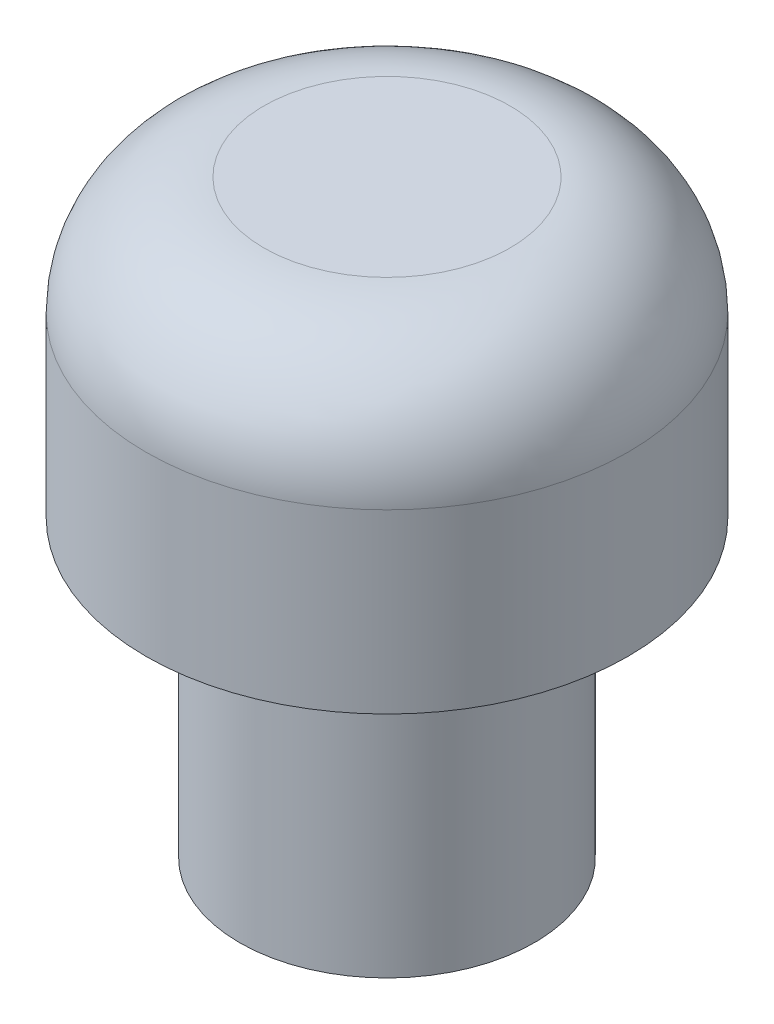
ISO-10303-21;
HEADER;
FILE_DESCRIPTION(('STEP AP214'),'2;1');
FILE_NAME('part.step','',(''),(''),'','','');
FILE_SCHEMA(('AUTOMOTIVE_DESIGN { 1 0 10303 214 1 1 1 1 }'));
ENDSEC;
DATA;
#1=APPLICATION_CONTEXT('core data for automotive mechanical design processes');
#2=APPLICATION_PROTOCOL_DEFINITION('international standard','automotive_design',2000,#1);
#3=PRODUCT_CONTEXT('',#1,'mechanical');
#4=PRODUCT('Part','Part','',(#3));
#5=PRODUCT_RELATED_PRODUCT_CATEGORY('part','',(#4));
#6=PRODUCT_DEFINITION_FORMATION('','',#4);
#7=PRODUCT_DEFINITION_CONTEXT('part definition',#1,'design');
#8=PRODUCT_DEFINITION('design','',#6,#7);
#9=PRODUCT_DEFINITION_SHAPE('','',#8);
#10=(LENGTH_UNIT() NAMED_UNIT(*) SI_UNIT(.MILLI.,.METRE.));
#11=(NAMED_UNIT(*) PLANE_ANGLE_UNIT() SI_UNIT($,.RADIAN.));
#12=(NAMED_UNIT(*) SI_UNIT($,.STERADIAN.) SOLID_ANGLE_UNIT());
#13=UNCERTAINTY_MEASURE_WITH_UNIT(LENGTH_MEASURE(1.E-05),#10,'distance_accuracy_value','');
#14=(GEOMETRIC_REPRESENTATION_CONTEXT(3) GLOBAL_UNCERTAINTY_ASSIGNED_CONTEXT((#13)) GLOBAL_UNIT_ASSIGNED_CONTEXT((#10,
#11,#12)) REPRESENTATION_CONTEXT('',''));
#15=CARTESIAN_POINT('',(0.,0.,0.));
#16=DIRECTION('',(0.,0.,1.));
#17=DIRECTION('',(1.,0.,0.));
#18=AXIS2_PLACEMENT_3D('',#15,#16,#17);
#19=CARTESIAN_POINT('',(0.,6.35,0.));
#20=DIRECTION('',(0.,-1.,0.));
#21=DIRECTION('',(0.,0.,-1.));
#22=AXIS2_PLACEMENT_3D('',#19,#20,#21);
#23=CYLINDRICAL_SURFACE('',#22,3.175);
#24=CARTESIAN_POINT('',(0.,6.35,0.));
#25=DIRECTION('',(0.,1.,0.));
#26=DIRECTION('',(0.,0.,1.));
#27=AXIS2_PLACEMENT_3D('',#24,#25,#26);
#28=CIRCLE('',#27,3.175);
#29=CARTESIAN_POINT('',(0.,6.35,3.175));
#30=VERTEX_POINT('',#29);
#31=EDGE_CURVE('E50',#30,#30,#28,.T.);
#32=ORIENTED_EDGE('',*,*,#31,.F.);
#33=EDGE_LOOP('',(#32));
#34=FACE_BOUND('',#33,.T.);
#35=CARTESIAN_POINT('',(0.,0.,0.));
#36=DIRECTION('',(0.,1.,0.));
#37=DIRECTION('',(0.,0.,1.));
#38=AXIS2_PLACEMENT_3D('',#35,#36,#37);
#39=CIRCLE('',#38,3.175);
#40=CARTESIAN_POINT('',(0.,0.,3.175));
#41=VERTEX_POINT('',#40);
#42=EDGE_CURVE('E55',#41,#41,#39,.T.);
#43=ORIENTED_EDGE('',*,*,#42,.T.);
#44=EDGE_LOOP('',(#43));
#45=FACE_BOUND('',#44,.T.);
#46=ADVANCED_FACE('F37',(#34,#45),#23,.T.);
#47=CARTESIAN_POINT('',(0.,0.,0.));
#48=DIRECTION('',(0.,1.,0.));
#49=DIRECTION('',(0.,0.,1.));
#50=AXIS2_PLACEMENT_3D('',#47,#48,#49);
#51=PLANE('',#50);
#52=ORIENTED_EDGE('',*,*,#42,.F.);
#53=EDGE_LOOP('',(#52));
#54=FACE_BOUND('',#53,.T.);
#55=ADVANCED_FACE('F81',(#54),#51,.F.);
#56=CARTESIAN_POINT('',(0.,12.7,0.));
#57=DIRECTION('',(0.,-1.,0.));
#58=DIRECTION('',(0.,0.,-1.));
#59=AXIS2_PLACEMENT_3D('',#56,#57,#58);
#60=CYLINDRICAL_SURFACE('',#59,5.1920131688595);
#61=CARTESIAN_POINT('',(0.,10.16,0.));
#62=DIRECTION('',(0.,1.,0.));
#63=DIRECTION('',(0.,0.,1.));
#64=AXIS2_PLACEMENT_3D('',#61,#62,#63);
#65=CIRCLE('',#64,5.1920131688595);
#66=CARTESIAN_POINT('',(0.,10.16,5.1920131688595));
#67=VERTEX_POINT('',#66);
#68=EDGE_CURVE('E10',#67,#67,#65,.F.);
#69=ORIENTED_EDGE('',*,*,#68,.T.);
#70=EDGE_LOOP('',(#69));
#71=FACE_BOUND('',#70,.T.);
#72=CARTESIAN_POINT('',(0.,6.35,0.));
#73=DIRECTION('',(0.,1.,0.));
#74=DIRECTION('',(0.,0.,1.));
#75=AXIS2_PLACEMENT_3D('',#72,#73,#74);
#76=CIRCLE('',#75,5.1920131688595);
#77=CARTESIAN_POINT('',(0.,6.35,5.1920131688595));
#78=VERTEX_POINT('',#77);
#79=EDGE_CURVE('E60',#78,#78,#76,.T.);
#80=ORIENTED_EDGE('',*,*,#79,.T.);
#81=EDGE_LOOP('',(#80));
#82=FACE_BOUND('',#81,.T.);
#83=ADVANCED_FACE('F66',(#71,#82),#60,.T.);
#84=CARTESIAN_POINT('',(0.,12.7,0.));
#85=DIRECTION('',(0.,1.,0.));
#86=DIRECTION('',(0.,0.,1.));
#87=AXIS2_PLACEMENT_3D('',#84,#85,#86);
#88=PLANE('',#87);
#89=CARTESIAN_POINT('',(0.,12.7,0.));
#90=DIRECTION('',(0.,1.,0.));
#91=DIRECTION('',(0.,0.,1.));
#92=AXIS2_PLACEMENT_3D('',#89,#90,#91);
#93=CIRCLE('',#92,2.6520131688595);
#94=CARTESIAN_POINT('',(0.,12.7,2.6520131688595));
#95=VERTEX_POINT('',#94);
#96=EDGE_CURVE('E45',#95,#95,#93,.T.);
#97=ORIENTED_EDGE('',*,*,#96,.T.);
#98=EDGE_LOOP('',(#97));
#99=FACE_BOUND('',#98,.T.);
#100=ADVANCED_FACE('F70',(#99),#88,.T.);
#101=CARTESIAN_POINT('',(0.,6.35,0.));
#102=DIRECTION('',(0.,1.,0.));
#103=DIRECTION('',(0.,0.,1.));
#104=AXIS2_PLACEMENT_3D('',#101,#102,#103);
#105=PLANE('',#104);
#106=ORIENTED_EDGE('',*,*,#31,.T.);
#107=EDGE_LOOP('',(#106));
#108=FACE_BOUND('',#107,.T.);
#109=ORIENTED_EDGE('',*,*,#79,.F.);
#110=EDGE_LOOP('',(#109));
#111=FACE_BOUND('',#110,.T.);
#112=ADVANCED_FACE('F68',(#108,#111),#105,.F.);
#113=CARTESIAN_POINT('',(0.,10.16,0.));
#114=DIRECTION('',(0.,1.,0.));
#115=DIRECTION('',(0.,0.,1.));
#116=AXIS2_PLACEMENT_3D('',#113,#114,#115);
#117=TOROIDAL_SURFACE('',#116,2.6520131688595,2.54);
#118=ORIENTED_EDGE('',*,*,#68,.F.);
#119=EDGE_LOOP('',(#118));
#120=FACE_BOUND('',#119,.T.);
#121=ORIENTED_EDGE('',*,*,#96,.F.);
#122=EDGE_LOOP('',(#121));
#123=FACE_BOUND('',#122,.T.);
#124=ADVANCED_FACE('F39',(#120,#123),#117,.T.);
#125=CLOSED_SHELL('',(#46,#55,#83,#100,#112,#124));
#126=MANIFOLD_SOLID_BREP('B2',#125);
#127=ADVANCED_BREP_SHAPE_REPRESENTATION('',(#18,#126),#14);
#128=SHAPE_DEFINITION_REPRESENTATION(#9,#127);
ENDSEC;
END-ISO-10303-21;
